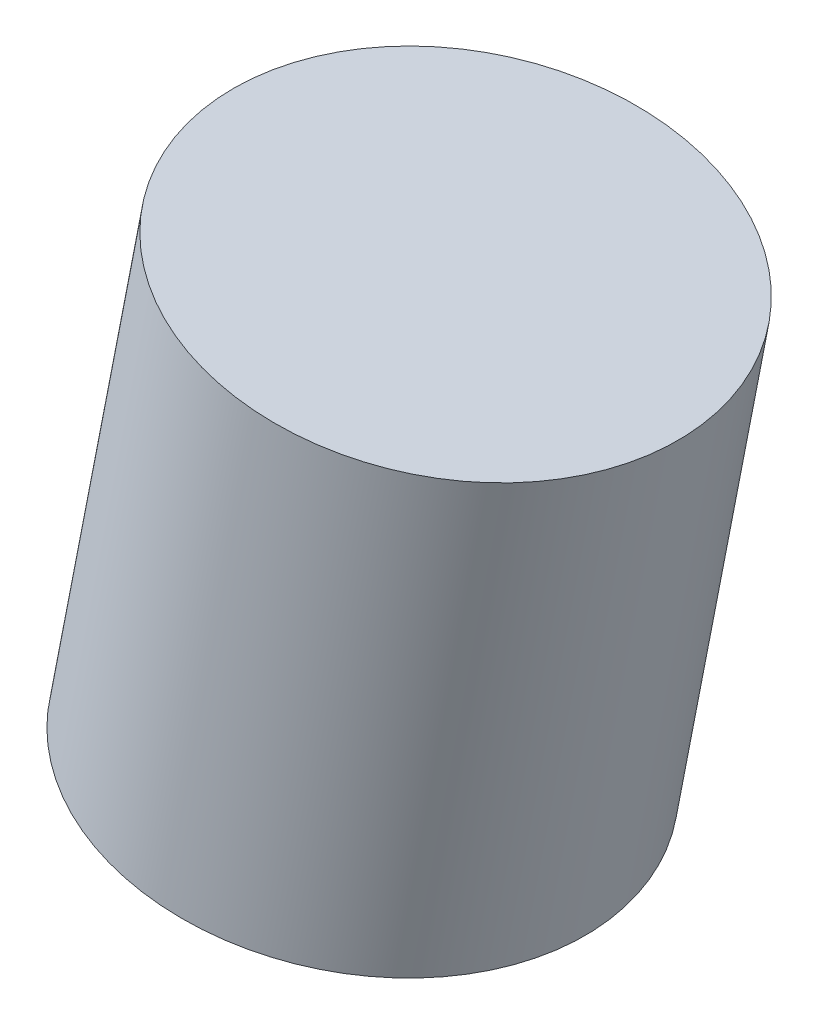
ISO-10303-21;
HEADER;
FILE_DESCRIPTION(('STEP AP214'),'2;1');
FILE_NAME('part.step','',(''),(''),'','','');
FILE_SCHEMA(('AUTOMOTIVE_DESIGN { 1 0 10303 214 1 1 1 1 }'));
ENDSEC;
DATA;
#1=APPLICATION_CONTEXT('core data for automotive mechanical design processes');
#2=APPLICATION_PROTOCOL_DEFINITION('international standard','automotive_design',2000,#1);
#3=PRODUCT_CONTEXT('',#1,'mechanical');
#4=PRODUCT('Part','Part','',(#3));
#5=PRODUCT_RELATED_PRODUCT_CATEGORY('part','',(#4));
#6=PRODUCT_DEFINITION_FORMATION('','',#4);
#7=PRODUCT_DEFINITION_CONTEXT('part definition',#1,'design');
#8=PRODUCT_DEFINITION('design','',#6,#7);
#9=PRODUCT_DEFINITION_SHAPE('','',#8);
#10=(LENGTH_UNIT() NAMED_UNIT(*) SI_UNIT(.MILLI.,.METRE.));
#11=(NAMED_UNIT(*) PLANE_ANGLE_UNIT() SI_UNIT($,.RADIAN.));
#12=(NAMED_UNIT(*) SI_UNIT($,.STERADIAN.) SOLID_ANGLE_UNIT());
#13=UNCERTAINTY_MEASURE_WITH_UNIT(LENGTH_MEASURE(1.E-05),#10,'distance_accuracy_value','');
#14=(GEOMETRIC_REPRESENTATION_CONTEXT(3) GLOBAL_UNCERTAINTY_ASSIGNED_CONTEXT((#13)) GLOBAL_UNIT_ASSIGNED_CONTEXT((#10,
#11,#12)) REPRESENTATION_CONTEXT('',''));
#15=CARTESIAN_POINT('',(0.,0.,0.));
#16=DIRECTION('',(0.,0.,1.));
#17=DIRECTION('',(1.,0.,0.));
#18=AXIS2_PLACEMENT_3D('',#15,#16,#17);
#19=CARTESIAN_POINT('',(18.2741809285442,-53.4130232832634,-26.9768481121731));
#20=DIRECTION('',(-0.187069809821492,-0.982327232502345,0.0061720772544734));
#21=DIRECTION('',(0.982345943687806,-0.187073373092253,0.));
#22=AXIS2_PLACEMENT_3D('',#19,#20,#21);
#23=CYLINDRICAL_SURFACE('',#22,7.5);
#24=CARTESIAN_POINT('',(18.2741809285442,-53.4130232832634,-26.9768481121731));
#25=DIRECTION('',(0.187069809821492,0.982327232502345,-0.0061720772544734));
#26=DIRECTION('',(-0.982345943687806,0.187073373092253,0.));
#27=AXIS2_PLACEMENT_3D('',#24,#25,#26);
#28=CIRCLE('',#27,7.5);
#29=CARTESIAN_POINT('',(10.9065863508856,-52.0099729850715,-26.9768481121731));
#30=VERTEX_POINT('',#29);
#31=EDGE_CURVE('E10',#30,#30,#28,.T.);
#32=ORIENTED_EDGE('',*,*,#31,.F.);
#33=EDGE_LOOP('',(#32));
#34=FACE_BOUND('',#33,.T.);
#35=CARTESIAN_POINT('',(15.2810639714003,-69.1302590033009,-26.8780948761015));
#36=DIRECTION('',(0.187069809821492,0.982327232502345,-0.0061720772544734));
#37=DIRECTION('',(-0.982345943687806,0.187073373092253,0.));
#38=AXIS2_PLACEMENT_3D('',#35,#36,#37);
#39=CIRCLE('',#38,7.5);
#40=CARTESIAN_POINT('',(7.91346939374175,-67.727208705109,-26.8780948761015));
#41=VERTEX_POINT('',#40);
#42=EDGE_CURVE('E42',#41,#41,#39,.T.);
#43=ORIENTED_EDGE('',*,*,#42,.T.);
#44=EDGE_LOOP('',(#43));
#45=FACE_BOUND('',#44,.T.);
#46=ADVANCED_FACE('F39',(#34,#45),#23,.T.);
#47=CARTESIAN_POINT('',(18.2741809285442,-53.4130232832634,-26.9768481121731));
#48=DIRECTION('',(0.187069809821492,0.982327232502345,-0.0061720772544734));
#49=DIRECTION('',(-0.982345943687806,0.187073373092253,0.));
#50=AXIS2_PLACEMENT_3D('',#47,#48,#49);
#51=PLANE('',#50);
#52=ORIENTED_EDGE('',*,*,#31,.T.);
#53=EDGE_LOOP('',(#52));
#54=FACE_BOUND('',#53,.T.);
#55=ADVANCED_FACE('F54',(#54),#51,.T.);
#56=CARTESIAN_POINT('',(15.2810639714003,-69.1302590033009,-26.8780948761015));
#57=DIRECTION('',(0.187069809821492,0.982327232502345,-0.0061720772544734));
#58=DIRECTION('',(-0.982345943687806,0.187073373092253,0.));
#59=AXIS2_PLACEMENT_3D('',#56,#57,#58);
#60=PLANE('',#59);
#61=ORIENTED_EDGE('',*,*,#42,.F.);
#62=EDGE_LOOP('',(#61));
#63=FACE_BOUND('',#62,.T.);
#64=ADVANCED_FACE('F52',(#63),#60,.F.);
#65=CLOSED_SHELL('',(#46,#55,#64));
#66=MANIFOLD_SOLID_BREP('B2',#65);
#67=ADVANCED_BREP_SHAPE_REPRESENTATION('',(#18,#66),#14);
#68=SHAPE_DEFINITION_REPRESENTATION(#9,#67);
ENDSEC;
END-ISO-10303-21;
